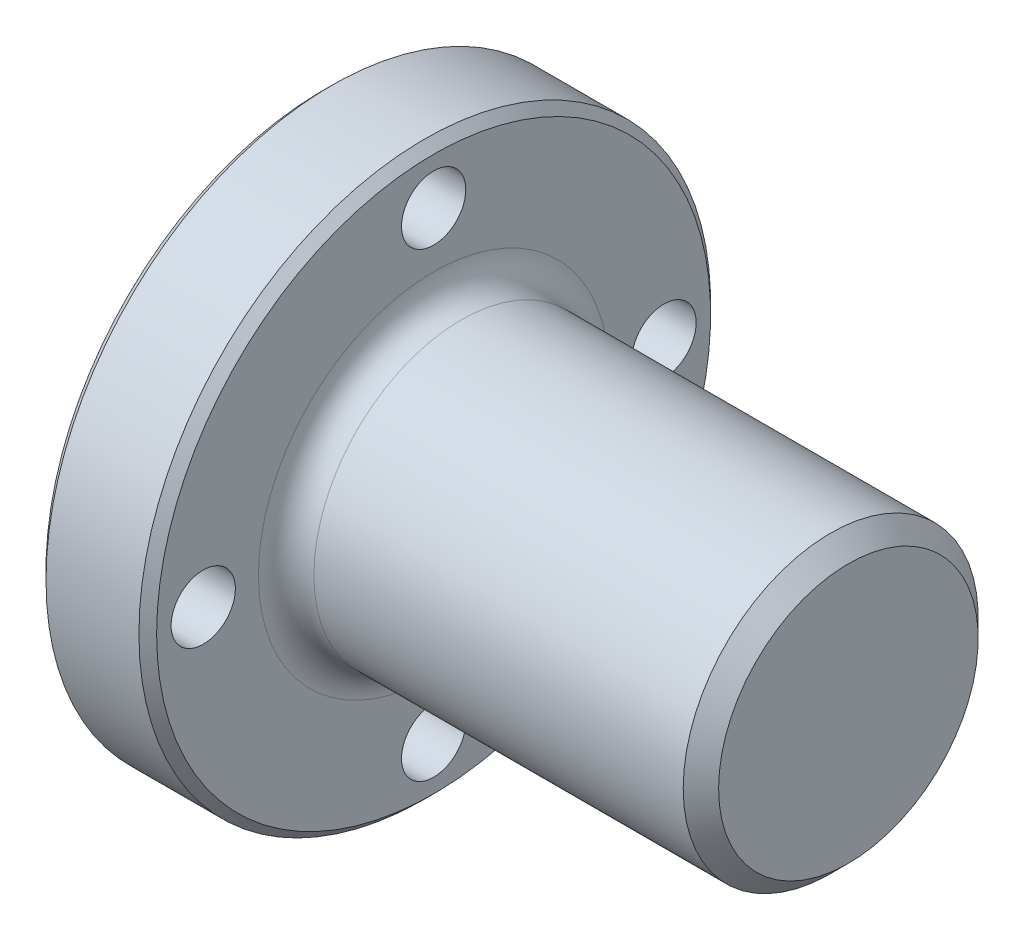
ISO-10303-21;
HEADER;
FILE_DESCRIPTION(('STEP AP214'),'2;1');
FILE_NAME('part.step','',(''),(''),'','','');
FILE_SCHEMA(('AUTOMOTIVE_DESIGN { 1 0 10303 214 1 1 1 1 }'));
ENDSEC;
DATA;
#1=APPLICATION_CONTEXT('core data for automotive mechanical design processes');
#2=APPLICATION_PROTOCOL_DEFINITION('international standard','automotive_design',2000,#1);
#3=PRODUCT_CONTEXT('',#1,'mechanical');
#4=PRODUCT('Part','Part','',(#3));
#5=PRODUCT_RELATED_PRODUCT_CATEGORY('part','',(#4));
#6=PRODUCT_DEFINITION_FORMATION('','',#4);
#7=PRODUCT_DEFINITION_CONTEXT('part definition',#1,'design');
#8=PRODUCT_DEFINITION('design','',#6,#7);
#9=PRODUCT_DEFINITION_SHAPE('','',#8);
#10=(LENGTH_UNIT() NAMED_UNIT(*) SI_UNIT(.MILLI.,.METRE.));
#11=(NAMED_UNIT(*) PLANE_ANGLE_UNIT() SI_UNIT($,.RADIAN.));
#12=(NAMED_UNIT(*) SI_UNIT($,.STERADIAN.) SOLID_ANGLE_UNIT());
#13=UNCERTAINTY_MEASURE_WITH_UNIT(LENGTH_MEASURE(1.E-05),#10,'distance_accuracy_value','');
#14=(GEOMETRIC_REPRESENTATION_CONTEXT(3) GLOBAL_UNCERTAINTY_ASSIGNED_CONTEXT((#13)) GLOBAL_UNIT_ASSIGNED_CONTEXT((#10,
#11,#12)) REPRESENTATION_CONTEXT('',''));
#15=CARTESIAN_POINT('',(0.,0.,0.));
#16=DIRECTION('',(0.,0.,1.));
#17=DIRECTION('',(1.,0.,0.));
#18=AXIS2_PLACEMENT_3D('',#15,#16,#17);
#19=CARTESIAN_POINT('',(0.,0.,0.));
#20=DIRECTION('',(1.,0.,0.));
#21=DIRECTION('',(0.,0.,-1.));
#22=AXIS2_PLACEMENT_3D('',#19,#20,#21);
#23=PLANE('',#22);
#24=CARTESIAN_POINT('',(0.,0.,0.));
#25=DIRECTION('',(1.,0.,0.));
#26=DIRECTION('',(0.,0.,-1.));
#27=AXIS2_PLACEMENT_3D('',#24,#25,#26);
#28=CIRCLE('',#27,7.95020000000003);
#29=CARTESIAN_POINT('',(0.,0.,-7.95020000000003));
#30=VERTEX_POINT('',#29);
#31=EDGE_CURVE('E59',#30,#30,#28,.F.);
#32=ORIENTED_EDGE('',*,*,#31,.T.);
#33=EDGE_LOOP('',(#32));
#34=FACE_BOUND('',#33,.T.);
#35=ADVANCED_FACE('F43',(#34),#23,.F.);
#36=CARTESIAN_POINT('',(-25.4,0.,0.));
#37=DIRECTION('',(-1.,0.,0.));
#38=DIRECTION('',(0.,0.,1.));
#39=AXIS2_PLACEMENT_3D('',#36,#37,#38);
#40=CYLINDRICAL_SURFACE('',#39,8.7122);
#41=CARTESIAN_POINT('',(0.761999999999978,0.,0.));
#42=DIRECTION('',(1.,0.,0.));
#43=DIRECTION('',(0.,0.,-1.));
#44=AXIS2_PLACEMENT_3D('',#41,#42,#43);
#45=CIRCLE('',#44,8.7122);
#46=CARTESIAN_POINT('',(0.761999999999978,0.,-8.7122));
#47=VERTEX_POINT('',#46);
#48=EDGE_CURVE('E55',#47,#47,#45,.T.);
#49=ORIENTED_EDGE('',*,*,#48,.T.);
#50=EDGE_LOOP('',(#49));
#51=FACE_BOUND('',#50,.T.);
#52=CARTESIAN_POINT('',(4.826,0.,0.));
#53=DIRECTION('',(-1.,0.,0.));
#54=DIRECTION('',(0.,0.,1.));
#55=AXIS2_PLACEMENT_3D('',#52,#53,#54);
#56=CIRCLE('',#55,8.7122);
#57=CARTESIAN_POINT('',(4.826,0.,8.7122));
#58=VERTEX_POINT('',#57);
#59=EDGE_CURVE('E82',#58,#58,#56,.T.);
#60=ORIENTED_EDGE('',*,*,#59,.T.);
#61=EDGE_LOOP('',(#60));
#62=FACE_BOUND('',#61,.T.);
#63=ADVANCED_FACE('F146',(#51,#62),#40,.T.);
#64=CARTESIAN_POINT('',(4.826,8.7122,0.));
#65=DIRECTION('',(1.,0.,0.));
#66=DIRECTION('',(0.,0.,-1.));
#67=AXIS2_PLACEMENT_3D('',#64,#65,#66);
#68=PLANE('',#67);
#69=CARTESIAN_POINT('',(4.826,0.,19.8374));
#70=DIRECTION('',(1.,0.,0.));
#71=DIRECTION('',(0.,0.,-1.));
#72=AXIS2_PLACEMENT_3D('',#69,#70,#71);
#73=CIRCLE('',#72,2.7686);
#74=CARTESIAN_POINT('',(4.826,0.,17.0688));
#75=VERTEX_POINT('',#74);
#76=EDGE_CURVE('E91',#75,#75,#73,.T.);
#77=ORIENTED_EDGE('',*,*,#76,.T.);
#78=EDGE_LOOP('',(#77));
#79=FACE_BOUND('',#78,.T.);
#80=CARTESIAN_POINT('',(4.826,-19.8374,0.));
#81=DIRECTION('',(1.,0.,0.));
#82=DIRECTION('',(0.,0.,-1.));
#83=AXIS2_PLACEMENT_3D('',#80,#81,#82);
#84=CIRCLE('',#83,2.7686);
#85=CARTESIAN_POINT('',(4.826,-19.8374,-2.7686));
#86=VERTEX_POINT('',#85);
#87=EDGE_CURVE('E94',#86,#86,#84,.T.);
#88=ORIENTED_EDGE('',*,*,#87,.T.);
#89=EDGE_LOOP('',(#88));
#90=FACE_BOUND('',#89,.T.);
#91=CARTESIAN_POINT('',(4.826,0.,-19.8374));
#92=DIRECTION('',(1.,0.,0.));
#93=DIRECTION('',(0.,0.,-1.));
#94=AXIS2_PLACEMENT_3D('',#91,#92,#93);
#95=CIRCLE('',#94,2.7686);
#96=CARTESIAN_POINT('',(4.826,0.,-22.606));
#97=VERTEX_POINT('',#96);
#98=EDGE_CURVE('E97',#97,#97,#95,.T.);
#99=ORIENTED_EDGE('',*,*,#98,.T.);
#100=EDGE_LOOP('',(#99));
#101=FACE_BOUND('',#100,.T.);
#102=CARTESIAN_POINT('',(4.826,19.8374,0.));
#103=DIRECTION('',(1.,0.,0.));
#104=DIRECTION('',(0.,0.,-1.));
#105=AXIS2_PLACEMENT_3D('',#102,#103,#104);
#106=CIRCLE('',#105,2.7686);
#107=CARTESIAN_POINT('',(4.826,19.8374,-2.7686));
#108=VERTEX_POINT('',#107);
#109=EDGE_CURVE('E85',#108,#108,#106,.T.);
#110=ORIENTED_EDGE('',*,*,#109,.T.);
#111=EDGE_LOOP('',(#110));
#112=FACE_BOUND('',#111,.T.);
#113=CARTESIAN_POINT('',(4.826,0.,0.));
#114=DIRECTION('',(1.,0.,0.));
#115=DIRECTION('',(0.,0.,-1.));
#116=AXIS2_PLACEMENT_3D('',#113,#114,#115);
#117=CIRCLE('',#116,23.8506);
#118=CARTESIAN_POINT('',(4.826,0.,-23.8506));
#119=VERTEX_POINT('',#118);
#120=EDGE_CURVE('E64',#119,#119,#117,.F.);
#121=ORIENTED_EDGE('',*,*,#120,.T.);
#122=EDGE_LOOP('',(#121));
#123=FACE_BOUND('',#122,.T.);
#124=ORIENTED_EDGE('',*,*,#59,.F.);
#125=EDGE_LOOP('',(#124));
#126=FACE_BOUND('',#125,.T.);
#127=ADVANCED_FACE('F151',(#79,#90,#101,#112,#123,#126),#68,.F.);
#128=CARTESIAN_POINT('',(-25.4,0.,0.));
#129=DIRECTION('',(-1.,0.,0.));
#130=DIRECTION('',(0.,0.,1.));
#131=AXIS2_PLACEMENT_3D('',#128,#129,#130);
#132=CYLINDRICAL_SURFACE('',#131,24.6126);
#133=CARTESIAN_POINT('',(13.589,0.,0.));
#134=DIRECTION('',(-1.,0.,0.));
#135=DIRECTION('',(0.,0.,1.));
#136=AXIS2_PLACEMENT_3D('',#133,#134,#135);
#137=CIRCLE('',#136,24.6126);
#138=CARTESIAN_POINT('',(13.589,0.,24.6126));
#139=VERTEX_POINT('',#138);
#140=EDGE_CURVE('E70',#139,#139,#137,.T.);
#141=ORIENTED_EDGE('',*,*,#140,.T.);
#142=EDGE_LOOP('',(#141));
#143=FACE_BOUND('',#142,.T.);
#144=CARTESIAN_POINT('',(5.58800000000002,0.,0.));
#145=DIRECTION('',(1.,0.,0.));
#146=DIRECTION('',(0.,0.,-1.));
#147=AXIS2_PLACEMENT_3D('',#144,#145,#146);
#148=CIRCLE('',#147,24.6126);
#149=CARTESIAN_POINT('',(5.58800000000002,0.,-24.6126));
#150=VERTEX_POINT('',#149);
#151=EDGE_CURVE('E73',#150,#150,#148,.T.);
#152=ORIENTED_EDGE('',*,*,#151,.T.);
#153=EDGE_LOOP('',(#152));
#154=FACE_BOUND('',#153,.T.);
#155=ADVANCED_FACE('F117',(#143,#154),#132,.T.);
#156=CARTESIAN_POINT('',(14.351,24.6126,0.));
#157=DIRECTION('',(-1.,0.,0.));
#158=DIRECTION('',(0.,0.,1.));
#159=AXIS2_PLACEMENT_3D('',#156,#157,#158);
#160=PLANE('',#159);
#161=CARTESIAN_POINT('',(14.351,0.,19.8374));
#162=DIRECTION('',(1.,0.,0.));
#163=DIRECTION('',(0.,0.,-1.));
#164=AXIS2_PLACEMENT_3D('',#161,#162,#163);
#165=CIRCLE('',#164,2.7686);
#166=CARTESIAN_POINT('',(14.351,0.,17.0688));
#167=VERTEX_POINT('',#166);
#168=EDGE_CURVE('E100',#167,#167,#165,.T.);
#169=ORIENTED_EDGE('',*,*,#168,.F.);
#170=EDGE_LOOP('',(#169));
#171=FACE_BOUND('',#170,.T.);
#172=CARTESIAN_POINT('',(14.351,-19.8374,0.));
#173=DIRECTION('',(1.,0.,0.));
#174=DIRECTION('',(0.,0.,-1.));
#175=AXIS2_PLACEMENT_3D('',#172,#173,#174);
#176=CIRCLE('',#175,2.7686);
#177=CARTESIAN_POINT('',(14.351,-19.8374,-2.7686));
#178=VERTEX_POINT('',#177);
#179=EDGE_CURVE('E104',#178,#178,#176,.T.);
#180=ORIENTED_EDGE('',*,*,#179,.F.);
#181=EDGE_LOOP('',(#180));
#182=FACE_BOUND('',#181,.T.);
#183=CARTESIAN_POINT('',(14.351,0.,-19.8374));
#184=DIRECTION('',(1.,0.,0.));
#185=DIRECTION('',(0.,0.,-1.));
#186=AXIS2_PLACEMENT_3D('',#183,#184,#185);
#187=CIRCLE('',#186,2.7686);
#188=CARTESIAN_POINT('',(14.351,0.,-22.606));
#189=VERTEX_POINT('',#188);
#190=EDGE_CURVE('E101',#189,#189,#187,.T.);
#191=ORIENTED_EDGE('',*,*,#190,.F.);
#192=EDGE_LOOP('',(#191));
#193=FACE_BOUND('',#192,.T.);
#194=CARTESIAN_POINT('',(14.351,19.8374,0.));
#195=DIRECTION('',(1.,0.,0.));
#196=DIRECTION('',(0.,0.,-1.));
#197=AXIS2_PLACEMENT_3D('',#194,#195,#196);
#198=CIRCLE('',#197,2.7686);
#199=CARTESIAN_POINT('',(14.351,19.8374,-2.7686));
#200=VERTEX_POINT('',#199);
#201=EDGE_CURVE('E88',#200,#200,#198,.T.);
#202=ORIENTED_EDGE('',*,*,#201,.F.);
#203=EDGE_LOOP('',(#202));
#204=FACE_BOUND('',#203,.T.);
#205=CARTESIAN_POINT('',(14.351,0.,0.));
#206=DIRECTION('',(-1.,0.,0.));
#207=DIRECTION('',(0.,0.,1.));
#208=AXIS2_PLACEMENT_3D('',#205,#206,#207);
#209=CIRCLE('',#208,23.8506);
#210=CARTESIAN_POINT('',(14.351,0.,23.8506));
#211=VERTEX_POINT('',#210);
#212=EDGE_CURVE('E67',#211,#211,#209,.F.);
#213=ORIENTED_EDGE('',*,*,#212,.T.);
#214=EDGE_LOOP('',(#213));
#215=FACE_BOUND('',#214,.T.);
#216=CARTESIAN_POINT('',(14.351,0.,0.));
#217=DIRECTION('',(-1.,0.,0.));
#218=DIRECTION('',(0.,0.,1.));
#219=AXIS2_PLACEMENT_3D('',#216,#217,#218);
#220=CIRCLE('',#219,15.0876);
#221=CARTESIAN_POINT('',(14.351,0.,15.0876));
#222=VERTEX_POINT('',#221);
#223=EDGE_CURVE('E79',#222,#222,#220,.T.);
#224=ORIENTED_EDGE('',*,*,#223,.T.);
#225=EDGE_LOOP('',(#224));
#226=FACE_BOUND('',#225,.T.);
#227=ADVANCED_FACE('F113',(#171,#182,#193,#204,#215,#226),#160,.F.);
#228=CARTESIAN_POINT('',(-25.4,0.,0.));
#229=DIRECTION('',(-1.,0.,0.));
#230=DIRECTION('',(0.,0.,1.));
#231=AXIS2_PLACEMENT_3D('',#228,#229,#230);
#232=CYLINDRICAL_SURFACE('',#231,12.7);
#233=CARTESIAN_POINT('',(48.5394,0.,0.));
#234=DIRECTION('',(-1.,0.,0.));
#235=DIRECTION('',(0.,0.,1.));
#236=AXIS2_PLACEMENT_3D('',#233,#234,#235);
#237=CIRCLE('',#236,12.7);
#238=CARTESIAN_POINT('',(48.5394,0.,12.7));
#239=VERTEX_POINT('',#238);
#240=EDGE_CURVE('E51',#239,#239,#237,.T.);
#241=ORIENTED_EDGE('',*,*,#240,.T.);
#242=EDGE_LOOP('',(#241));
#243=FACE_BOUND('',#242,.T.);
#244=CARTESIAN_POINT('',(16.7386,0.,0.));
#245=DIRECTION('',(-1.,0.,0.));
#246=DIRECTION('',(0.,0.,1.));
#247=AXIS2_PLACEMENT_3D('',#244,#245,#246);
#248=CIRCLE('',#247,12.7);
#249=CARTESIAN_POINT('',(16.7386,0.,12.7));
#250=VERTEX_POINT('',#249);
#251=EDGE_CURVE('E76',#250,#250,#248,.F.);
#252=ORIENTED_EDGE('',*,*,#251,.T.);
#253=EDGE_LOOP('',(#252));
#254=FACE_BOUND('',#253,.T.);
#255=ADVANCED_FACE('F116',(#243,#254),#232,.T.);
#256=CARTESIAN_POINT('',(50.0634,12.7,0.));
#257=DIRECTION('',(-1.,0.,0.));
#258=DIRECTION('',(0.,0.,1.));
#259=AXIS2_PLACEMENT_3D('',#256,#257,#258);
#260=PLANE('',#259);
#261=CARTESIAN_POINT('',(50.0634,0.,0.));
#262=DIRECTION('',(-1.,0.,0.));
#263=DIRECTION('',(0.,0.,1.));
#264=AXIS2_PLACEMENT_3D('',#261,#262,#263);
#265=CIRCLE('',#264,11.176);
#266=CARTESIAN_POINT('',(50.0634,0.,11.176));
#267=VERTEX_POINT('',#266);
#268=EDGE_CURVE('E10',#267,#267,#265,.F.);
#269=ORIENTED_EDGE('',*,*,#268,.T.);
#270=EDGE_LOOP('',(#269));
#271=FACE_BOUND('',#270,.T.);
#272=ADVANCED_FACE('F132',(#271),#260,.F.);
#273=CARTESIAN_POINT('',(16.7386,0.,0.));
#274=DIRECTION('',(-1.,0.,0.));
#275=DIRECTION('',(0.,0.,1.));
#276=AXIS2_PLACEMENT_3D('',#273,#274,#275);
#277=TOROIDAL_SURFACE('',#276,15.0876,2.3876);
#278=ORIENTED_EDGE('',*,*,#251,.F.);
#279=EDGE_LOOP('',(#278));
#280=FACE_BOUND('',#279,.T.);
#281=ORIENTED_EDGE('',*,*,#223,.F.);
#282=EDGE_LOOP('',(#281));
#283=FACE_BOUND('',#282,.T.);
#284=ADVANCED_FACE('F129',(#280,#283),#277,.F.);
#285=CARTESIAN_POINT('',(13.589,0.,0.));
#286=DIRECTION('',(-1.,0.,0.));
#287=DIRECTION('',(0.,0.,1.));
#288=AXIS2_PLACEMENT_3D('',#285,#286,#287);
#289=CONICAL_SURFACE('',#288,24.6126,0.785398163397457);
#290=ORIENTED_EDGE('',*,*,#212,.F.);
#291=EDGE_LOOP('',(#290));
#292=FACE_BOUND('',#291,.T.);
#293=ORIENTED_EDGE('',*,*,#140,.F.);
#294=EDGE_LOOP('',(#293));
#295=FACE_BOUND('',#294,.T.);
#296=ADVANCED_FACE('F131',(#292,#295),#289,.T.);
#297=CARTESIAN_POINT('',(4.826,0.,0.));
#298=DIRECTION('',(1.,0.,0.));
#299=DIRECTION('',(0.,0.,-1.));
#300=AXIS2_PLACEMENT_3D('',#297,#298,#299);
#301=CONICAL_SURFACE('',#300,23.8506,0.785398163397432);
#302=ORIENTED_EDGE('',*,*,#151,.F.);
#303=EDGE_LOOP('',(#302));
#304=FACE_BOUND('',#303,.T.);
#305=ORIENTED_EDGE('',*,*,#120,.F.);
#306=EDGE_LOOP('',(#305));
#307=FACE_BOUND('',#306,.T.);
#308=ADVANCED_FACE('F139',(#304,#307),#301,.T.);
#309=CARTESIAN_POINT('',(0.,0.,0.));
#310=DIRECTION('',(1.,0.,0.));
#311=DIRECTION('',(0.,0.,-1.));
#312=AXIS2_PLACEMENT_3D('',#309,#310,#311);
#313=CONICAL_SURFACE('',#312,7.95020000000003,0.785398163397446);
#314=ORIENTED_EDGE('',*,*,#48,.F.);
#315=EDGE_LOOP('',(#314));
#316=FACE_BOUND('',#315,.T.);
#317=ORIENTED_EDGE('',*,*,#31,.F.);
#318=EDGE_LOOP('',(#317));
#319=FACE_BOUND('',#318,.T.);
#320=ADVANCED_FACE('F212',(#316,#319),#313,.T.);
#321=CARTESIAN_POINT('',(48.5394,0.,0.));
#322=DIRECTION('',(-1.,0.,0.));
#323=DIRECTION('',(0.,0.,1.));
#324=AXIS2_PLACEMENT_3D('',#321,#322,#323);
#325=CONICAL_SURFACE('',#324,12.7,0.785398163397452);
#326=ORIENTED_EDGE('',*,*,#268,.F.);
#327=EDGE_LOOP('',(#326));
#328=FACE_BOUND('',#327,.T.);
#329=ORIENTED_EDGE('',*,*,#240,.F.);
#330=EDGE_LOOP('',(#329));
#331=FACE_BOUND('',#330,.T.);
#332=ADVANCED_FACE('F46',(#328,#331),#325,.T.);
#333=CARTESIAN_POINT('',(0.,19.8374,0.));
#334=DIRECTION('',(1.,0.,0.));
#335=DIRECTION('',(0.,0.,-1.));
#336=AXIS2_PLACEMENT_3D('',#333,#334,#335);
#337=CYLINDRICAL_SURFACE('',#336,2.7686);
#338=ORIENTED_EDGE('',*,*,#201,.T.);
#339=EDGE_LOOP('',(#338));
#340=FACE_BOUND('',#339,.T.);
#341=ORIENTED_EDGE('',*,*,#109,.F.);
#342=EDGE_LOOP('',(#341));
#343=FACE_BOUND('',#342,.T.);
#344=ADVANCED_FACE('F163',(#340,#343),#337,.F.);
#345=CARTESIAN_POINT('',(0.,0.,-19.8374));
#346=DIRECTION('',(1.,0.,0.));
#347=DIRECTION('',(0.,0.,-1.));
#348=AXIS2_PLACEMENT_3D('',#345,#346,#347);
#349=CYLINDRICAL_SURFACE('',#348,2.7686);
#350=ORIENTED_EDGE('',*,*,#190,.T.);
#351=EDGE_LOOP('',(#350));
#352=FACE_BOUND('',#351,.T.);
#353=ORIENTED_EDGE('',*,*,#98,.F.);
#354=EDGE_LOOP('',(#353));
#355=FACE_BOUND('',#354,.T.);
#356=ADVANCED_FACE('F166',(#352,#355),#349,.F.);
#357=CARTESIAN_POINT('',(0.,-19.8374,0.));
#358=DIRECTION('',(1.,0.,0.));
#359=DIRECTION('',(0.,0.,-1.));
#360=AXIS2_PLACEMENT_3D('',#357,#358,#359);
#361=CYLINDRICAL_SURFACE('',#360,2.7686);
#362=ORIENTED_EDGE('',*,*,#179,.T.);
#363=EDGE_LOOP('',(#362));
#364=FACE_BOUND('',#363,.T.);
#365=ORIENTED_EDGE('',*,*,#87,.F.);
#366=EDGE_LOOP('',(#365));
#367=FACE_BOUND('',#366,.T.);
#368=ADVANCED_FACE('F170',(#364,#367),#361,.F.);
#369=CARTESIAN_POINT('',(0.,0.,19.8374));
#370=DIRECTION('',(1.,0.,0.));
#371=DIRECTION('',(0.,0.,-1.));
#372=AXIS2_PLACEMENT_3D('',#369,#370,#371);
#373=CYLINDRICAL_SURFACE('',#372,2.7686);
#374=ORIENTED_EDGE('',*,*,#168,.T.);
#375=EDGE_LOOP('',(#374));
#376=FACE_BOUND('',#375,.T.);
#377=ORIENTED_EDGE('',*,*,#76,.F.);
#378=EDGE_LOOP('',(#377));
#379=FACE_BOUND('',#378,.T.);
#380=ADVANCED_FACE('F110',(#376,#379),#373,.F.);
#381=CLOSED_SHELL('',(#35,#63,#127,#155,#227,#255,#272,#284,#296,#308,#320,#332,#344,#356,#368,#380));
#382=MANIFOLD_SOLID_BREP('B2',#381);
#383=ADVANCED_BREP_SHAPE_REPRESENTATION('',(#18,#382),#14);
#384=SHAPE_DEFINITION_REPRESENTATION(#9,#383);
ENDSEC;
END-ISO-10303-21;
